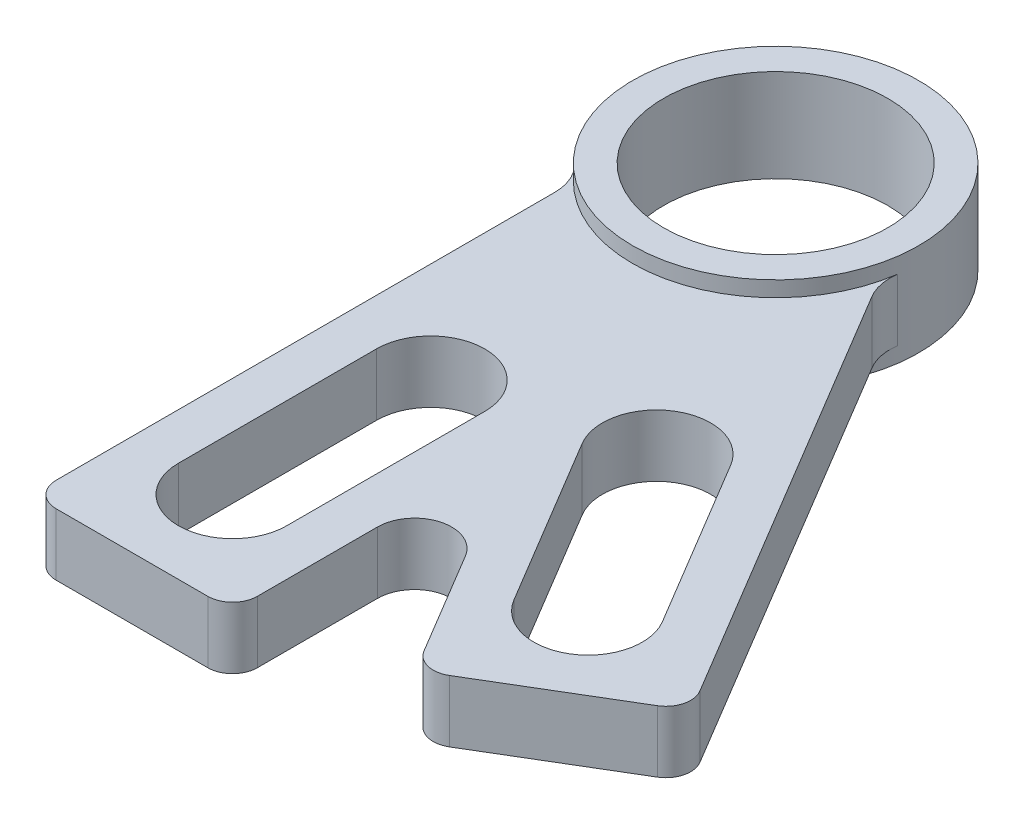
ISO-10303-21;
HEADER;
FILE_DESCRIPTION(('STEP AP214'),'2;1');
FILE_NAME('part.step','',(''),(''),'','','');
FILE_SCHEMA(('AUTOMOTIVE_DESIGN { 1 0 10303 214 1 1 1 1 }'));
ENDSEC;
DATA;
#1=APPLICATION_CONTEXT('core data for automotive mechanical design processes');
#2=APPLICATION_PROTOCOL_DEFINITION('international standard','automotive_design',2000,#1);
#3=PRODUCT_CONTEXT('',#1,'mechanical');
#4=PRODUCT('Part','Part','',(#3));
#5=PRODUCT_RELATED_PRODUCT_CATEGORY('part','',(#4));
#6=PRODUCT_DEFINITION_FORMATION('','',#4);
#7=PRODUCT_DEFINITION_CONTEXT('part definition',#1,'design');
#8=PRODUCT_DEFINITION('design','',#6,#7);
#9=PRODUCT_DEFINITION_SHAPE('','',#8);
#10=(LENGTH_UNIT() NAMED_UNIT(*) SI_UNIT(.MILLI.,.METRE.));
#11=(NAMED_UNIT(*) PLANE_ANGLE_UNIT() SI_UNIT($,.RADIAN.));
#12=(NAMED_UNIT(*) SI_UNIT($,.STERADIAN.) SOLID_ANGLE_UNIT());
#13=UNCERTAINTY_MEASURE_WITH_UNIT(LENGTH_MEASURE(1.E-05),#10,'distance_accuracy_value','');
#14=(GEOMETRIC_REPRESENTATION_CONTEXT(3) GLOBAL_UNCERTAINTY_ASSIGNED_CONTEXT((#13)) GLOBAL_UNIT_ASSIGNED_CONTEXT((#10,
#11,#12)) REPRESENTATION_CONTEXT('',''));
#15=CARTESIAN_POINT('',(0.,0.,0.));
#16=DIRECTION('',(0.,0.,1.));
#17=DIRECTION('',(1.,0.,0.));
#18=AXIS2_PLACEMENT_3D('',#15,#16,#17);
#19=CARTESIAN_POINT('',(0.,4.7625,0.));
#20=DIRECTION('',(0.,-1.,0.));
#21=DIRECTION('',(0.,0.,-1.));
#22=AXIS2_PLACEMENT_3D('',#19,#20,#21);
#23=CYLINDRICAL_SURFACE('',#22,11.5062);
#24=CARTESIAN_POINT('',(0.,4.7625,0.));
#25=DIRECTION('',(0.,1.,0.));
#26=DIRECTION('',(0.,0.,1.));
#27=AXIS2_PLACEMENT_3D('',#24,#25,#26);
#28=CIRCLE('',#27,11.5062);
#29=CARTESIAN_POINT('',(0.,4.7625,-11.5062));
#30=VERTEX_POINT('',#29);
#31=EDGE_CURVE('E300',#30,#30,#28,.T.);
#32=CARTESIAN_POINT('',(0.,-4.7625,0.));
#33=DIRECTION('',(0.,1.,0.));
#34=DIRECTION('',(0.,0.,1.));
#35=AXIS2_PLACEMENT_3D('',#32,#33,#34);
#36=CIRCLE('',#35,11.5062);
#37=CARTESIAN_POINT('',(0.,-4.7625,-11.5062));
#38=VERTEX_POINT('',#37);
#39=EDGE_CURVE('E295',#38,#38,#36,.T.);
#40=CARTESIAN_POINT('',(0.,4.7625,-11.5062));
#41=CARTESIAN_POINT('',(0.,4.66328125,-11.5062));
#42=CARTESIAN_POINT('',(0.,4.5640625,-11.5062));
#43=CARTESIAN_POINT('',(0.,4.365625,-11.5062));
#44=CARTESIAN_POINT('',(0.,4.26640625,-11.5062));
#45=CARTESIAN_POINT('',(0.,4.06796875,-11.5062));
#46=CARTESIAN_POINT('',(0.,3.96875,-11.5062));
#47=CARTESIAN_POINT('',(0.,3.7703125,-11.5062));
#48=CARTESIAN_POINT('',(0.,3.67109375,-11.5062));
#49=CARTESIAN_POINT('',(0.,3.47265625,-11.5062));
#50=CARTESIAN_POINT('',(0.,3.3734375,-11.5062));
#51=CARTESIAN_POINT('',(0.,3.175,-11.5062));
#52=CARTESIAN_POINT('',(0.,3.07578125,-11.5062));
#53=CARTESIAN_POINT('',(0.,2.87734375,-11.5062));
#54=CARTESIAN_POINT('',(0.,2.778125,-11.5062));
#55=CARTESIAN_POINT('',(0.,2.5796875,-11.5062));
#56=CARTESIAN_POINT('',(0.,2.48046875,-11.5062));
#57=CARTESIAN_POINT('',(0.,2.28203125,-11.5062));
#58=CARTESIAN_POINT('',(0.,2.1828125,-11.5062));
#59=CARTESIAN_POINT('',(0.,1.984375,-11.5062));
#60=CARTESIAN_POINT('',(0.,1.88515625,-11.5062));
#61=CARTESIAN_POINT('',(0.,1.68671875,-11.5062));
#62=CARTESIAN_POINT('',(0.,1.5875,-11.5062));
#63=CARTESIAN_POINT('',(0.,1.3890625,-11.5062));
#64=CARTESIAN_POINT('',(0.,1.28984375,-11.5062));
#65=CARTESIAN_POINT('',(0.,1.09140625,-11.5062));
#66=CARTESIAN_POINT('',(0.,0.992187499999999,-11.5062));
#67=CARTESIAN_POINT('',(0.,0.79375,-11.5062));
#68=CARTESIAN_POINT('',(0.,0.69453125,-11.5062));
#69=CARTESIAN_POINT('',(0.,0.49609375,-11.5062));
#70=CARTESIAN_POINT('',(0.,0.396875,-11.5062));
#71=CARTESIAN_POINT('',(0.,0.1984375,-11.5062));
#72=CARTESIAN_POINT('',(0.,0.0992187500000001,-11.5062));
#73=CARTESIAN_POINT('',(0.,-0.0992187500000001,-11.5062));
#74=CARTESIAN_POINT('',(0.,-0.1984375,-11.5062));
#75=CARTESIAN_POINT('',(0.,-0.396875,-11.5062));
#76=CARTESIAN_POINT('',(0.,-0.49609375,-11.5062));
#77=CARTESIAN_POINT('',(0.,-0.69453125,-11.5062));
#78=CARTESIAN_POINT('',(0.,-0.793750000000001,-11.5062));
#79=CARTESIAN_POINT('',(0.,-0.992187500000001,-11.5062));
#80=CARTESIAN_POINT('',(0.,-1.09140625,-11.5062));
#81=CARTESIAN_POINT('',(0.,-1.28984375,-11.5062));
#82=CARTESIAN_POINT('',(0.,-1.3890625,-11.5062));
#83=CARTESIAN_POINT('',(0.,-1.5875,-11.5062));
#84=CARTESIAN_POINT('',(0.,-1.68671875,-11.5062));
#85=CARTESIAN_POINT('',(0.,-1.88515625,-11.5062));
#86=CARTESIAN_POINT('',(0.,-1.984375,-11.5062));
#87=CARTESIAN_POINT('',(0.,-2.1828125,-11.5062));
#88=CARTESIAN_POINT('',(0.,-2.28203125,-11.5062));
#89=CARTESIAN_POINT('',(0.,-2.48046875,-11.5062));
#90=CARTESIAN_POINT('',(0.,-2.5796875,-11.5062));
#91=CARTESIAN_POINT('',(0.,-2.778125,-11.5062));
#92=CARTESIAN_POINT('',(0.,-2.87734375,-11.5062));
#93=CARTESIAN_POINT('',(0.,-3.07578125,-11.5062));
#94=CARTESIAN_POINT('',(0.,-3.175,-11.5062));
#95=CARTESIAN_POINT('',(0.,-3.3734375,-11.5062));
#96=CARTESIAN_POINT('',(0.,-3.47265625,-11.5062));
#97=CARTESIAN_POINT('',(0.,-3.67109375,-11.5062));
#98=CARTESIAN_POINT('',(0.,-3.7703125,-11.5062));
#99=CARTESIAN_POINT('',(0.,-3.96875,-11.5062));
#100=CARTESIAN_POINT('',(0.,-4.06796875,-11.5062));
#101=CARTESIAN_POINT('',(0.,-4.26640625,-11.5062));
#102=CARTESIAN_POINT('',(0.,-4.365625,-11.5062));
#103=CARTESIAN_POINT('',(0.,-4.5640625,-11.5062));
#104=CARTESIAN_POINT('',(0.,-4.66328125,-11.5062));
#105=CARTESIAN_POINT('',(0.,-4.7625,-11.5062));
#106=B_SPLINE_CURVE_WITH_KNOTS('',3,(#40,#41,#42,#43,#44,#45,#46,#47,#48,#49,#50,#51,#52,#53,
#54,#55,#56,#57,#58,#59,#60,#61,#62,#63,#64,#65,#66,#67,#68,#69,#70,#71,#72,#73,#74,#75,#76,#77,
#78,#79,#80,#81,#82,#83,#84,#85,#86,#87,#88,#89,#90,#91,#92,#93,#94,#95,#96,#97,#98,#99,#100,
#101,#102,#103,#104,#105),.UNSPECIFIED.,.F.,.F.,(4,2,2,2,2,2,2,2,2,2,2,2,2,2,2,2,2,2,2,2,2,2,2,
2,2,2,2,2,2,2,2,2,4),(0.,0.29765625,0.5953125,0.892968750000001,1.190625,1.48828125,1.7859375,
2.08359375,2.38125,2.67890625,2.9765625,3.27421875,3.571875,3.86953125,4.1671875,4.46484375,
4.7625,5.06015625,5.3578125,5.65546875,5.953125,6.25078125,6.5484375,6.84609375,7.14375,
7.44140625,7.7390625,8.03671875,8.334375,8.63203125,8.9296875,9.22734375,9.525),.UNSPECIFIED.);
#107=EDGE_CURVE('BSEAM43',#30,#38,#106,.T.);
#108=ORIENTED_EDGE('',*,*,#31,.T.);
#109=ORIENTED_EDGE('',*,*,#39,.F.);
#110=ORIENTED_EDGE('',*,*,#107,.T.);
#111=ORIENTED_EDGE('',*,*,#107,.F.);
#112=EDGE_LOOP('',(#108,#110,#109,#111));
#113=FACE_BOUND('',#112,.T.);
#114=ADVANCED_FACE('F43',(#113),#23,.F.);
#115=CARTESIAN_POINT('',(0.,4.7625,0.));
#116=DIRECTION('',(0.,-1.,0.));
#117=DIRECTION('',(0.,0.,-1.));
#118=AXIS2_PLACEMENT_3D('',#115,#116,#117);
#119=CYLINDRICAL_SURFACE('',#118,14.6812);
#120=DIRECTION('',(0.,-1.,0.));
#121=VECTOR('',#120,1.);
#122=CARTESIAN_POINT('',(14.5403853423193,4.7625,2.0285037680185));
#123=LINE('',#122,#121);
#124=CARTESIAN_POINT('',(14.5403853423193,3.175,2.0285037680185));
#125=VERTEX_POINT('',#124);
#126=CARTESIAN_POINT('',(14.5403853423193,-3.175,2.0285037680185));
#127=VERTEX_POINT('',#126);
#128=EDGE_CURVE('E314',#125,#127,#123,.T.);
#129=ORIENTED_EDGE('',*,*,#128,.T.);
#130=CARTESIAN_POINT('',(0.,-3.175,0.));
#131=DIRECTION('',(0.,1.,0.));
#132=DIRECTION('',(0.,0.,1.));
#133=AXIS2_PLACEMENT_3D('',#130,#131,#132);
#134=CIRCLE('',#133,14.6812);
#135=CARTESIAN_POINT('',(-11.4402024421594,-3.175,9.20105437014751));
#136=VERTEX_POINT('',#135);
#137=EDGE_CURVE('E273',#136,#127,#134,.T.);
#138=ORIENTED_EDGE('',*,*,#137,.F.);
#139=DIRECTION('',(0.,-1.,0.));
#140=VECTOR('',#139,1.);
#141=CARTESIAN_POINT('',(-11.4402024421594,4.7625,9.20105437014751));
#142=LINE('',#141,#140);
#143=CARTESIAN_POINT('',(-11.4402024421594,3.175,9.20105437014751));
#144=VERTEX_POINT('',#143);
#145=EDGE_CURVE('E307',#136,#144,#142,.F.);
#146=ORIENTED_EDGE('',*,*,#145,.T.);
#147=CARTESIAN_POINT('',(0.,3.175,0.));
#148=DIRECTION('',(0.,1.,0.));
#149=DIRECTION('',(0.,0.,1.));
#150=AXIS2_PLACEMENT_3D('',#147,#148,#149);
#151=CIRCLE('',#150,14.6812);
#152=EDGE_CURVE('E234',#144,#125,#151,.T.);
#153=ORIENTED_EDGE('',*,*,#152,.T.);
#154=EDGE_LOOP('',(#129,#138,#146,#153));
#155=FACE_BOUND('',#154,.T.);
#156=CARTESIAN_POINT('',(0.,4.7625,0.));
#157=DIRECTION('',(0.,1.,0.));
#158=DIRECTION('',(0.,0.,1.));
#159=AXIS2_PLACEMENT_3D('',#156,#157,#158);
#160=CIRCLE('',#159,14.6812);
#161=CARTESIAN_POINT('',(0.,4.7625,14.6812));
#162=VERTEX_POINT('',#161);
#163=EDGE_CURVE('E303',#162,#162,#160,.T.);
#164=ORIENTED_EDGE('',*,*,#163,.F.);
#165=EDGE_LOOP('',(#164));
#166=FACE_BOUND('',#165,.T.);
#167=CARTESIAN_POINT('',(0.,-4.7625,0.));
#168=DIRECTION('',(0.,1.,0.));
#169=DIRECTION('',(0.,0.,1.));
#170=AXIS2_PLACEMENT_3D('',#167,#168,#169);
#171=CIRCLE('',#170,14.6812);
#172=CARTESIAN_POINT('',(0.,-4.7625,14.6812));
#173=VERTEX_POINT('',#172);
#174=EDGE_CURVE('E304',#173,#173,#171,.T.);
#175=ORIENTED_EDGE('',*,*,#174,.T.);
#176=EDGE_LOOP('',(#175));
#177=FACE_BOUND('',#176,.T.);
#178=ADVANCED_FACE('F412',(#155,#166,#177),#119,.T.);
#179=CARTESIAN_POINT('',(0.,4.7625,0.));
#180=DIRECTION('',(0.,1.,0.));
#181=DIRECTION('',(0.,0.,1.));
#182=AXIS2_PLACEMENT_3D('',#179,#180,#181);
#183=PLANE('',#182);
#184=ORIENTED_EDGE('',*,*,#31,.F.);
#185=EDGE_LOOP('',(#184));
#186=FACE_BOUND('',#185,.T.);
#187=ORIENTED_EDGE('',*,*,#163,.T.);
#188=EDGE_LOOP('',(#187));
#189=FACE_BOUND('',#188,.T.);
#190=ADVANCED_FACE('F447',(#186,#189),#183,.T.);
#191=CARTESIAN_POINT('',(0.,-4.7625,0.));
#192=DIRECTION('',(0.,1.,0.));
#193=DIRECTION('',(0.,0.,1.));
#194=AXIS2_PLACEMENT_3D('',#191,#192,#193);
#195=PLANE('',#194);
#196=ORIENTED_EDGE('',*,*,#39,.T.);
#197=EDGE_LOOP('',(#196));
#198=FACE_BOUND('',#197,.T.);
#199=ORIENTED_EDGE('',*,*,#174,.F.);
#200=EDGE_LOOP('',(#199));
#201=FACE_BOUND('',#200,.T.);
#202=ADVANCED_FACE('F558',(#198,#201),#195,.F.);
#203=CARTESIAN_POINT('',(-10.31875,3.175,0.));
#204=DIRECTION('',(-1.,0.,0.));
#205=DIRECTION('',(0.,0.,1.));
#206=AXIS2_PLACEMENT_3D('',#203,#204,#205);
#207=PLANE('',#206);
#208=DIRECTION('',(0.,0.,-1.));
#209=VECTOR('',#208,1.);
#210=CARTESIAN_POINT('',(-10.31875,-3.175,0.));
#211=LINE('',#210,#209);
#212=CARTESIAN_POINT('',(-10.31875,-3.175,63.5));
#213=VERTEX_POINT('',#212);
#214=CARTESIAN_POINT('',(-10.31875,-3.175,12.3848102075688));
#215=VERTEX_POINT('',#214);
#216=EDGE_CURVE('E275',#213,#215,#211,.T.);
#217=ORIENTED_EDGE('',*,*,#216,.F.);
#218=DIRECTION('',(0.,-1.,0.));
#219=VECTOR('',#218,1.);
#220=CARTESIAN_POINT('',(-10.31875,3.175,63.5));
#221=LINE('',#220,#219);
#222=CARTESIAN_POINT('',(-10.31875,3.175,63.5));
#223=VERTEX_POINT('',#222);
#224=EDGE_CURVE('E366',#213,#223,#221,.F.);
#225=ORIENTED_EDGE('',*,*,#224,.T.);
#226=DIRECTION('',(0.,0.,-1.));
#227=VECTOR('',#226,1.);
#228=CARTESIAN_POINT('',(-10.31875,3.175,0.));
#229=LINE('',#228,#227);
#230=CARTESIAN_POINT('',(-10.31875,3.175,12.3848102075688));
#231=VERTEX_POINT('',#230);
#232=EDGE_CURVE('E236',#223,#231,#229,.T.);
#233=ORIENTED_EDGE('',*,*,#232,.T.);
#234=DIRECTION('',(0.,-1.,0.));
#235=VECTOR('',#234,1.);
#236=CARTESIAN_POINT('',(-10.31875,3.175,12.3848102075688));
#237=LINE('',#236,#235);
#238=EDGE_CURVE('E320',#231,#215,#237,.T.);
#239=ORIENTED_EDGE('',*,*,#238,.T.);
#240=EDGE_LOOP('',(#217,#225,#233,#239));
#241=FACE_BOUND('',#240,.T.);
#242=ADVANCED_FACE('F419',(#241),#207,.T.);
#243=CARTESIAN_POINT('',(0.,3.175,66.04));
#244=DIRECTION('',(0.,0.,-1.));
#245=DIRECTION('',(-1.,0.,0.));
#246=AXIS2_PLACEMENT_3D('',#243,#244,#245);
#247=PLANE('',#246);
#248=DIRECTION('',(1.,0.,0.));
#249=VECTOR('',#248,1.);
#250=CARTESIAN_POINT('',(0.,-3.175,66.04));
#251=LINE('',#250,#249);
#252=CARTESIAN_POINT('',(-7.77874999999999,-3.175,66.04));
#253=VERTEX_POINT('',#252);
#254=CARTESIAN_POINT('',(7.77875000000001,-3.175,66.04));
#255=VERTEX_POINT('',#254);
#256=EDGE_CURVE('E277',#253,#255,#251,.T.);
#257=ORIENTED_EDGE('',*,*,#256,.T.);
#258=DIRECTION('',(0.,-1.,0.));
#259=VECTOR('',#258,1.);
#260=CARTESIAN_POINT('',(7.77875000000001,3.175,66.04));
#261=LINE('',#260,#259);
#262=CARTESIAN_POINT('',(7.77875000000001,3.175,66.04));
#263=VERTEX_POINT('',#262);
#264=EDGE_CURVE('E364',#255,#263,#261,.F.);
#265=ORIENTED_EDGE('',*,*,#264,.T.);
#266=DIRECTION('',(1.,0.,0.));
#267=VECTOR('',#266,1.);
#268=CARTESIAN_POINT('',(0.,3.175,66.04));
#269=LINE('',#268,#267);
#270=CARTESIAN_POINT('',(-7.77874999999999,3.175,66.04));
#271=VERTEX_POINT('',#270);
#272=EDGE_CURVE('E238',#271,#263,#269,.T.);
#273=ORIENTED_EDGE('',*,*,#272,.F.);
#274=DIRECTION('',(0.,-1.,0.));
#275=VECTOR('',#274,1.);
#276=CARTESIAN_POINT('',(-7.77874999999999,-3.175,66.04));
#277=LINE('',#276,#275);
#278=EDGE_CURVE('E361',#271,#253,#277,.T.);
#279=ORIENTED_EDGE('',*,*,#278,.T.);
#280=EDGE_LOOP('',(#257,#265,#273,#279));
#281=FACE_BOUND('',#280,.T.);
#282=ADVANCED_FACE('F428',(#281),#247,.F.);
#283=CARTESIAN_POINT('',(10.31875,3.175,0.));
#284=DIRECTION('',(-1.,0.,0.));
#285=DIRECTION('',(0.,0.,1.));
#286=AXIS2_PLACEMENT_3D('',#283,#284,#285);
#287=PLANE('',#286);
#288=DIRECTION('',(0.,0.,-1.));
#289=VECTOR('',#288,1.);
#290=CARTESIAN_POINT('',(10.31875,-3.175,0.));
#291=LINE('',#290,#289);
#292=CARTESIAN_POINT('',(10.31875,-3.175,63.5));
#293=VERTEX_POINT('',#292);
#294=CARTESIAN_POINT('',(10.31875,-3.175,51.17750295843));
#295=VERTEX_POINT('',#294);
#296=EDGE_CURVE('E280',#293,#295,#291,.T.);
#297=ORIENTED_EDGE('',*,*,#296,.T.);
#298=DIRECTION('',(0.,-1.,0.));
#299=VECTOR('',#298,1.);
#300=CARTESIAN_POINT('',(10.31875,3.175,51.17750295843));
#301=LINE('',#300,#299);
#302=CARTESIAN_POINT('',(10.31875,3.175,51.17750295843));
#303=VERTEX_POINT('',#302);
#304=EDGE_CURVE('E64',#295,#303,#301,.F.);
#305=ORIENTED_EDGE('',*,*,#304,.T.);
#306=DIRECTION('',(0.,0.,-1.));
#307=VECTOR('',#306,1.);
#308=CARTESIAN_POINT('',(10.31875,3.175,0.));
#309=LINE('',#308,#307);
#310=CARTESIAN_POINT('',(10.31875,3.175,63.5));
#311=VERTEX_POINT('',#310);
#312=EDGE_CURVE('E241',#311,#303,#309,.T.);
#313=ORIENTED_EDGE('',*,*,#312,.F.);
#314=DIRECTION('',(0.,-1.,0.));
#315=VECTOR('',#314,1.);
#316=CARTESIAN_POINT('',(10.31875,3.175,63.5));
#317=LINE('',#316,#315);
#318=EDGE_CURVE('E358',#311,#293,#317,.T.);
#319=ORIENTED_EDGE('',*,*,#318,.T.);
#320=EDGE_LOOP('',(#297,#305,#313,#319));
#321=FACE_BOUND('',#320,.T.);
#322=ADVANCED_FACE('F434',(#321),#287,.F.);
#323=CARTESIAN_POINT('',(-8.85722342598743,3.175,5.29397721421647));
#324=DIRECTION('',(-0.858362052185321,0.,0.513044430208734));
#325=DIRECTION('',(0.513044430208734,0.,0.858362052185321));
#326=AXIS2_PLACEMENT_3D('',#323,#324,#325);
#327=PLANE('',#326);
#328=DIRECTION('',(-0.513044430208734,0.,-0.858362052185321));
#329=VECTOR('',#328,1.);
#330=CARTESIAN_POINT('',(-8.85722342598743,3.175,5.29397721421647));
#331=LINE('',#330,#329);
#332=CARTESIAN_POINT('',(23.7210978922672,3.175,59.7999675279844));
#333=VERTEX_POINT('',#332);
#334=CARTESIAN_POINT('',(17.3991094188261,3.175,49.2228036793348));
#335=VERTEX_POINT('',#334);
#336=EDGE_CURVE('E243',#333,#335,#331,.T.);
#337=ORIENTED_EDGE('',*,*,#336,.T.);
#338=DIRECTION('',(0.,-1.,0.));
#339=VECTOR('',#338,1.);
#340=CARTESIAN_POINT('',(17.3991094188261,3.175,49.2228036793348));
#341=LINE('',#340,#339);
#342=CARTESIAN_POINT('',(17.3991094188261,-3.175,49.2228036793348));
#343=VERTEX_POINT('',#342);
#344=EDGE_CURVE('E371',#335,#343,#341,.T.);
#345=ORIENTED_EDGE('',*,*,#344,.T.);
#346=DIRECTION('',(-0.513044430208734,0.,-0.858362052185321));
#347=VECTOR('',#346,1.);
#348=CARTESIAN_POINT('',(-8.85722342598743,-3.175,5.29397721421647));
#349=LINE('',#348,#347);
#350=CARTESIAN_POINT('',(23.7210978922672,-3.175,59.7999675279844));
#351=VERTEX_POINT('',#350);
#352=EDGE_CURVE('E282',#351,#343,#349,.T.);
#353=ORIENTED_EDGE('',*,*,#352,.F.);
#354=DIRECTION('',(0.,-1.,0.));
#355=VECTOR('',#354,1.);
#356=CARTESIAN_POINT('',(23.7210978922672,3.175,59.7999675279843));
#357=LINE('',#356,#355);
#358=EDGE_CURVE('E348',#351,#333,#357,.F.);
#359=ORIENTED_EDGE('',*,*,#358,.T.);
#360=EDGE_LOOP('',(#337,#345,#353,#359));
#361=FACE_BOUND('',#360,.T.);
#362=ADVANCED_FACE('F377',(#361),#327,.T.);
#363=CARTESIAN_POINT('',(33.8814541709848,3.175,56.6862299263186));
#364=DIRECTION('',(-0.513044430208734,0.,-0.858362052185321));
#365=DIRECTION('',(-0.858362052185321,0.,0.513044430208734));
#366=AXIS2_PLACEMENT_3D('',#363,#364,#365);
#367=PLANE('',#366);
#368=DIRECTION('',(0.858362052185321,0.,-0.513044430208734));
#369=VECTOR('',#368,1.);
#370=CARTESIAN_POINT('',(33.8814541709848,3.175,56.6862299263186));
#371=LINE('',#370,#369);
#372=CARTESIAN_POINT('',(27.2044703575481,3.175,60.6770742878049));
#373=VERTEX_POINT('',#372);
#374=CARTESIAN_POINT('',(40.5584379844212,3.175,52.6953855648325));
#375=VERTEX_POINT('',#374);
#376=EDGE_CURVE('E246',#373,#375,#371,.T.);
#377=ORIENTED_EDGE('',*,*,#376,.F.);
#378=DIRECTION('',(0.,-1.,0.));
#379=VECTOR('',#378,1.);
#380=CARTESIAN_POINT('',(27.2044703575481,-3.175,60.6770742878049));
#381=LINE('',#380,#379);
#382=CARTESIAN_POINT('',(27.2044703575481,-3.175,60.6770742878049));
#383=VERTEX_POINT('',#382);
#384=EDGE_CURVE('E337',#373,#383,#381,.T.);
#385=ORIENTED_EDGE('',*,*,#384,.T.);
#386=DIRECTION('',(0.858362052185321,0.,-0.513044430208734));
#387=VECTOR('',#386,1.);
#388=CARTESIAN_POINT('',(33.8814541709848,-3.175,56.6862299263186));
#389=LINE('',#388,#387);
#390=CARTESIAN_POINT('',(40.5584379844212,-3.175,52.6953855648325));
#391=VERTEX_POINT('',#390);
#392=EDGE_CURVE('E284',#383,#391,#389,.T.);
#393=ORIENTED_EDGE('',*,*,#392,.T.);
#394=DIRECTION('',(0.,-1.,0.));
#395=VECTOR('',#394,1.);
#396=CARTESIAN_POINT('',(40.5584379844212,3.175,52.6953855648325));
#397=LINE('',#396,#395);
#398=EDGE_CURVE('E335',#391,#375,#397,.F.);
#399=ORIENTED_EDGE('',*,*,#398,.T.);
#400=EDGE_LOOP('',(#377,#385,#393,#399));
#401=FACE_BOUND('',#400,.T.);
#402=ADVANCED_FACE('F390',(#401),#367,.F.);
#403=CARTESIAN_POINT('',(0.,3.175,35.40125));
#404=DIRECTION('',(0.,-1.,0.));
#405=DIRECTION('',(0.,0.,-1.));
#406=AXIS2_PLACEMENT_3D('',#403,#404,#405);
#407=CYLINDRICAL_SURFACE('',#406,5.55625);
#408=CARTESIAN_POINT('',(0.,-3.175,35.40125));
#409=DIRECTION('',(0.,1.,0.));
#410=DIRECTION('',(0.,0.,1.));
#411=AXIS2_PLACEMENT_3D('',#408,#409,#410);
#412=CIRCLE('',#411,5.55625);
#413=CARTESIAN_POINT('',(5.55625,-3.175,35.40125));
#414=VERTEX_POINT('',#413);
#415=CARTESIAN_POINT('',(-5.55624999999999,-3.175,35.40125));
#416=VERTEX_POINT('',#415);
#417=EDGE_CURVE('E261',#414,#416,#412,.T.);
#418=ORIENTED_EDGE('',*,*,#417,.F.);
#419=DIRECTION('',(0.,-1.,0.));
#420=VECTOR('',#419,1.);
#421=CARTESIAN_POINT('',(5.55625,3.175,35.40125));
#422=LINE('',#421,#420);
#423=CARTESIAN_POINT('',(5.55625,3.175,35.40125));
#424=VERTEX_POINT('',#423);
#425=EDGE_CURVE('E293',#424,#414,#422,.T.);
#426=ORIENTED_EDGE('',*,*,#425,.F.);
#427=CARTESIAN_POINT('',(0.,3.175,35.40125));
#428=DIRECTION('',(0.,1.,0.));
#429=DIRECTION('',(0.,0.,1.));
#430=AXIS2_PLACEMENT_3D('',#427,#428,#429);
#431=CIRCLE('',#430,5.55625);
#432=CARTESIAN_POINT('',(-5.55624999999999,3.175,35.40125));
#433=VERTEX_POINT('',#432);
#434=EDGE_CURVE('E223',#424,#433,#431,.T.);
#435=ORIENTED_EDGE('',*,*,#434,.T.);
#436=DIRECTION('',(0.,-1.,0.));
#437=VECTOR('',#436,1.);
#438=CARTESIAN_POINT('',(-5.55624999999999,3.175,35.40125));
#439=LINE('',#438,#437);
#440=EDGE_CURVE('E202',#433,#416,#439,.T.);
#441=ORIENTED_EDGE('',*,*,#440,.T.);
#442=EDGE_LOOP('',(#418,#426,#435,#441));
#443=FACE_BOUND('',#442,.T.);
#444=ADVANCED_FACE('F545',(#443),#407,.F.);
#445=CARTESIAN_POINT('',(5.55625,3.175,0.));
#446=DIRECTION('',(-1.,0.,0.));
#447=DIRECTION('',(0.,0.,1.));
#448=AXIS2_PLACEMENT_3D('',#445,#446,#447);
#449=PLANE('',#448);
#450=DIRECTION('',(0.,0.,-1.));
#451=VECTOR('',#450,1.);
#452=CARTESIAN_POINT('',(5.55625,-3.175,0.));
#453=LINE('',#452,#451);
#454=CARTESIAN_POINT('',(5.55625000000001,-3.175,55.72125));
#455=VERTEX_POINT('',#454);
#456=EDGE_CURVE('E264',#455,#414,#453,.T.);
#457=ORIENTED_EDGE('',*,*,#456,.F.);
#458=DIRECTION('',(0.,-1.,0.));
#459=VECTOR('',#458,1.);
#460=CARTESIAN_POINT('',(5.55625000000001,3.175,55.72125));
#461=LINE('',#460,#459);
#462=CARTESIAN_POINT('',(5.55625000000001,3.175,55.72125));
#463=VERTEX_POINT('',#462);
#464=EDGE_CURVE('E291',#463,#455,#461,.T.);
#465=ORIENTED_EDGE('',*,*,#464,.F.);
#466=DIRECTION('',(0.,0.,-1.));
#467=VECTOR('',#466,1.);
#468=CARTESIAN_POINT('',(5.55625,3.175,0.));
#469=LINE('',#468,#467);
#470=EDGE_CURVE('E226',#463,#424,#469,.T.);
#471=ORIENTED_EDGE('',*,*,#470,.T.);
#472=ORIENTED_EDGE('',*,*,#425,.T.);
#473=EDGE_LOOP('',(#457,#465,#471,#472));
#474=FACE_BOUND('',#473,.T.);
#475=ADVANCED_FACE('F635',(#474),#449,.T.);
#476=CARTESIAN_POINT('',(0.,3.175,55.72125));
#477=DIRECTION('',(0.,-1.,0.));
#478=DIRECTION('',(0.,0.,-1.));
#479=AXIS2_PLACEMENT_3D('',#476,#477,#478);
#480=CYLINDRICAL_SURFACE('',#479,5.55625);
#481=CARTESIAN_POINT('',(0.,-3.175,55.72125));
#482=DIRECTION('',(0.,1.,0.));
#483=DIRECTION('',(0.,0.,1.));
#484=AXIS2_PLACEMENT_3D('',#481,#482,#483);
#485=CIRCLE('',#484,5.55625);
#486=CARTESIAN_POINT('',(-5.55624999999999,-3.175,55.72125));
#487=VERTEX_POINT('',#486);
#488=EDGE_CURVE('E267',#487,#455,#485,.T.);
#489=ORIENTED_EDGE('',*,*,#488,.F.);
#490=DIRECTION('',(0.,-1.,0.));
#491=VECTOR('',#490,1.);
#492=CARTESIAN_POINT('',(-5.55624999999999,3.175,55.72125));
#493=LINE('',#492,#491);
#494=CARTESIAN_POINT('',(-5.55624999999999,3.175,55.72125));
#495=VERTEX_POINT('',#494);
#496=EDGE_CURVE('E289',#495,#487,#493,.T.);
#497=ORIENTED_EDGE('',*,*,#496,.F.);
#498=CARTESIAN_POINT('',(0.,3.175,55.72125));
#499=DIRECTION('',(0.,1.,0.));
#500=DIRECTION('',(0.,0.,1.));
#501=AXIS2_PLACEMENT_3D('',#498,#499,#500);
#502=CIRCLE('',#501,5.55625);
#503=EDGE_CURVE('E229',#495,#463,#502,.T.);
#504=ORIENTED_EDGE('',*,*,#503,.T.);
#505=ORIENTED_EDGE('',*,*,#464,.T.);
#506=EDGE_LOOP('',(#489,#497,#504,#505));
#507=FACE_BOUND('',#506,.T.);
#508=ADVANCED_FACE('F627',(#507),#480,.F.);
#509=CARTESIAN_POINT('',(18.1624141349268,3.175,30.3870895999257));
#510=DIRECTION('',(0.,-1.,0.));
#511=DIRECTION('',(0.,0.,-1.));
#512=AXIS2_PLACEMENT_3D('',#509,#510,#511);
#513=CYLINDRICAL_SURFACE('',#512,5.55625);
#514=CARTESIAN_POINT('',(18.1624141349268,-3.175,30.3870895999257));
#515=DIRECTION('',(0.,1.,0.));
#516=DIRECTION('',(0.,0.,1.));
#517=AXIS2_PLACEMENT_3D('',#514,#515,#516);
#518=CIRCLE('',#517,5.55625);
#519=CARTESIAN_POINT('',(22.9316882873815,-3.175,27.5364864845784));
#520=VERTEX_POINT('',#519);
#521=CARTESIAN_POINT('',(13.3931399824721,-3.175,33.237692715273));
#522=VERTEX_POINT('',#521);
#523=EDGE_CURVE('E197',#520,#522,#518,.T.);
#524=ORIENTED_EDGE('',*,*,#523,.F.);
#525=DIRECTION('',(0.,-1.,0.));
#526=VECTOR('',#525,1.);
#527=CARTESIAN_POINT('',(22.9316882873815,3.175,27.5364864845784));
#528=LINE('',#527,#526);
#529=CARTESIAN_POINT('',(22.9316882873815,3.175,27.5364864845784));
#530=VERTEX_POINT('',#529);
#531=EDGE_CURVE('E192',#530,#520,#528,.T.);
#532=ORIENTED_EDGE('',*,*,#531,.F.);
#533=CARTESIAN_POINT('',(18.1624141349268,3.175,30.3870895999257));
#534=DIRECTION('',(0.,1.,0.));
#535=DIRECTION('',(0.,0.,1.));
#536=AXIS2_PLACEMENT_3D('',#533,#534,#535);
#537=CIRCLE('',#536,5.55625);
#538=CARTESIAN_POINT('',(13.3931399824721,3.175,33.237692715273));
#539=VERTEX_POINT('',#538);
#540=EDGE_CURVE('E195',#530,#539,#537,.T.);
#541=ORIENTED_EDGE('',*,*,#540,.T.);
#542=DIRECTION('',(0.,-1.,0.));
#543=VECTOR('',#542,1.);
#544=CARTESIAN_POINT('',(13.3931399824721,3.175,33.237692715273));
#545=LINE('',#544,#543);
#546=EDGE_CURVE('E251',#539,#522,#545,.T.);
#547=ORIENTED_EDGE('',*,*,#546,.T.);
#548=EDGE_LOOP('',(#524,#532,#541,#547));
#549=FACE_BOUND('',#548,.T.);
#550=ADVANCED_FACE('F194',(#549),#513,.F.);
#551=CARTESIAN_POINT('',(4.76927415245452,3.175,-2.85060311534718));
#552=DIRECTION('',(-0.85836205218532,0.,0.513044430208734));
#553=DIRECTION('',(0.513044430208734,0.,0.858362052185321));
#554=AXIS2_PLACEMENT_3D('',#551,#552,#553);
#555=PLANE('',#554);
#556=DIRECTION('',(-0.513044430208734,0.,-0.858362052185321));
#557=VECTOR('',#556,1.);
#558=CARTESIAN_POINT('',(4.76927415245452,-3.175,-2.85060311534718));
#559=LINE('',#558,#557);
#560=CARTESIAN_POINT('',(33.356751109223,-3.175,44.9784033849841));
#561=VERTEX_POINT('',#560);
#562=EDGE_CURVE('E253',#561,#520,#559,.T.);
#563=ORIENTED_EDGE('',*,*,#562,.F.);
#564=DIRECTION('',(0.,-1.,0.));
#565=VECTOR('',#564,1.);
#566=CARTESIAN_POINT('',(33.356751109223,3.175,44.9784033849841));
#567=LINE('',#566,#565);
#568=CARTESIAN_POINT('',(33.356751109223,3.175,44.9784033849841));
#569=VERTEX_POINT('',#568);
#570=EDGE_CURVE('E203',#569,#561,#567,.T.);
#571=ORIENTED_EDGE('',*,*,#570,.F.);
#572=DIRECTION('',(-0.513044430208734,0.,-0.858362052185321));
#573=VECTOR('',#572,1.);
#574=CARTESIAN_POINT('',(4.76927415245452,3.175,-2.85060311534718));
#575=LINE('',#574,#573);
#576=EDGE_CURVE('E210',#569,#530,#575,.T.);
#577=ORIENTED_EDGE('',*,*,#576,.T.);
#578=ORIENTED_EDGE('',*,*,#531,.T.);
#579=EDGE_LOOP('',(#563,#571,#577,#578));
#580=FACE_BOUND('',#579,.T.);
#581=ADVANCED_FACE('F217',(#580),#555,.T.);
#582=CARTESIAN_POINT('',(28.5874769567683,3.175,47.8290065003314));
#583=DIRECTION('',(0.,-1.,0.));
#584=DIRECTION('',(0.,0.,-1.));
#585=AXIS2_PLACEMENT_3D('',#582,#583,#584);
#586=CYLINDRICAL_SURFACE('',#585,5.55625);
#587=CARTESIAN_POINT('',(28.5874769567683,-3.175,47.8290065003314));
#588=DIRECTION('',(0.,1.,0.));
#589=DIRECTION('',(0.,0.,1.));
#590=AXIS2_PLACEMENT_3D('',#587,#588,#589);
#591=CIRCLE('',#590,5.55625);
#592=CARTESIAN_POINT('',(23.8182028043136,-3.175,50.6796096156787));
#593=VERTEX_POINT('',#592);
#594=EDGE_CURVE('E255',#593,#561,#591,.T.);
#595=ORIENTED_EDGE('',*,*,#594,.F.);
#596=DIRECTION('',(0.,-1.,0.));
#597=VECTOR('',#596,1.);
#598=CARTESIAN_POINT('',(23.8182028043136,3.175,50.6796096156787));
#599=LINE('',#598,#597);
#600=CARTESIAN_POINT('',(23.8182028043136,3.175,50.6796096156787));
#601=VERTEX_POINT('',#600);
#602=EDGE_CURVE('E297',#601,#593,#599,.T.);
#603=ORIENTED_EDGE('',*,*,#602,.F.);
#604=CARTESIAN_POINT('',(28.5874769567683,3.175,47.8290065003314));
#605=DIRECTION('',(0.,1.,0.));
#606=DIRECTION('',(0.,0.,1.));
#607=AXIS2_PLACEMENT_3D('',#604,#605,#606);
#608=CIRCLE('',#607,5.55625);
#609=EDGE_CURVE('E218',#601,#569,#608,.T.);
#610=ORIENTED_EDGE('',*,*,#609,.T.);
#611=ORIENTED_EDGE('',*,*,#570,.T.);
#612=EDGE_LOOP('',(#595,#603,#610,#611));
#613=FACE_BOUND('',#612,.T.);
#614=ADVANCED_FACE('F603',(#613),#586,.F.);
#615=CARTESIAN_POINT('',(-5.55624999999999,3.175,0.));
#616=DIRECTION('',(-1.,0.,0.));
#617=DIRECTION('',(0.,0.,1.));
#618=AXIS2_PLACEMENT_3D('',#615,#616,#617);
#619=PLANE('',#618);
#620=DIRECTION('',(0.,0.,-1.));
#621=VECTOR('',#620,1.);
#622=CARTESIAN_POINT('',(-5.55624999999999,-3.175,0.));
#623=LINE('',#622,#621);
#624=EDGE_CURVE('E270',#487,#416,#623,.T.);
#625=ORIENTED_EDGE('',*,*,#624,.T.);
#626=ORIENTED_EDGE('',*,*,#440,.F.);
#627=DIRECTION('',(0.,0.,-1.));
#628=VECTOR('',#627,1.);
#629=CARTESIAN_POINT('',(-5.55624999999999,3.175,0.));
#630=LINE('',#629,#628);
#631=EDGE_CURVE('E232',#495,#433,#630,.T.);
#632=ORIENTED_EDGE('',*,*,#631,.F.);
#633=ORIENTED_EDGE('',*,*,#496,.T.);
#634=EDGE_LOOP('',(#625,#626,#632,#633));
#635=FACE_BOUND('',#634,.T.);
#636=ADVANCED_FACE('F594',(#635),#619,.F.);
#637=CARTESIAN_POINT('',(-4.76927415245485,3.175,2.85060311534737));
#638=DIRECTION('',(-0.858362052185321,0.,0.513044430208734));
#639=DIRECTION('',(0.513044430208734,0.,0.858362052185321));
#640=AXIS2_PLACEMENT_3D('',#637,#638,#639);
#641=PLANE('',#640);
#642=DIRECTION('',(-0.513044430208734,0.,-0.858362052185321));
#643=VECTOR('',#642,1.);
#644=CARTESIAN_POINT('',(-4.76927415245485,-3.175,2.85060311534737));
#645=LINE('',#644,#643);
#646=EDGE_CURVE('E258',#593,#522,#645,.T.);
#647=ORIENTED_EDGE('',*,*,#646,.T.);
#648=ORIENTED_EDGE('',*,*,#546,.F.);
#649=DIRECTION('',(-0.513044430208734,0.,-0.858362052185321));
#650=VECTOR('',#649,1.);
#651=CARTESIAN_POINT('',(-4.76927415245485,3.175,2.85060311534737));
#652=LINE('',#651,#650);
#653=EDGE_CURVE('E213',#601,#539,#652,.T.);
#654=ORIENTED_EDGE('',*,*,#653,.F.);
#655=ORIENTED_EDGE('',*,*,#602,.T.);
#656=EDGE_LOOP('',(#647,#648,#654,#655));
#657=FACE_BOUND('',#656,.T.);
#658=ADVANCED_FACE('F537',(#657),#641,.F.);
#659=CARTESIAN_POINT('',(8.85722342598713,3.175,-5.29397721421628));
#660=DIRECTION('',(-0.858362052185321,0.,0.513044430208734));
#661=DIRECTION('',(0.513044430208734,0.,0.858362052185321));
#662=AXIS2_PLACEMENT_3D('',#659,#660,#661);
#663=PLANE('',#662);
#664=DIRECTION('',(-0.513044430208734,0.,-0.858362052185321));
#665=VECTOR('',#664,1.);
#666=CARTESIAN_POINT('',(8.85722342598713,3.175,-5.29397721421628));
#667=LINE('',#666,#665);
#668=CARTESIAN_POINT('',(41.4355447442417,3.175,49.2120130995516));
#669=VERTEX_POINT('',#668);
#670=CARTESIAN_POINT('',(15.2111813221727,3.175,5.33667389147836));
#671=VERTEX_POINT('',#670);
#672=EDGE_CURVE('E249',#669,#671,#667,.T.);
#673=ORIENTED_EDGE('',*,*,#672,.F.);
#674=DIRECTION('',(0.,-1.,0.));
#675=VECTOR('',#674,1.);
#676=CARTESIAN_POINT('',(41.4355447442417,3.175,49.2120130995516));
#677=LINE('',#676,#675);
#678=CARTESIAN_POINT('',(41.4355447442417,-3.175,49.2120130995516));
#679=VERTEX_POINT('',#678);
#680=EDGE_CURVE('E368',#669,#679,#677,.T.);
#681=ORIENTED_EDGE('',*,*,#680,.T.);
#682=DIRECTION('',(-0.513044430208734,0.,-0.858362052185321));
#683=VECTOR('',#682,1.);
#684=CARTESIAN_POINT('',(8.85722342598713,-3.175,-5.29397721421628));
#685=LINE('',#684,#683);
#686=CARTESIAN_POINT('',(15.2111813221727,-3.175,5.33667389147836));
#687=VERTEX_POINT('',#686);
#688=EDGE_CURVE('E215',#679,#687,#685,.T.);
#689=ORIENTED_EDGE('',*,*,#688,.T.);
#690=DIRECTION('',(0.,1.,0.));
#691=VECTOR('',#690,1.);
#692=CARTESIAN_POINT('',(15.2111813221727,3.175,5.33667389147835));
#693=LINE('',#692,#691);
#694=EDGE_CURVE('E317',#687,#671,#693,.T.);
#695=ORIENTED_EDGE('',*,*,#694,.T.);
#696=EDGE_LOOP('',(#673,#681,#689,#695));
#697=FACE_BOUND('',#696,.T.);
#698=ADVANCED_FACE('F400',(#697),#663,.F.);
#699=CARTESIAN_POINT('',(0.,3.175,0.));
#700=DIRECTION('',(0.,1.,0.));
#701=DIRECTION('',(0.,0.,1.));
#702=AXIS2_PLACEMENT_3D('',#699,#700,#701);
#703=PLANE('',#702);
#704=ORIENTED_EDGE('',*,*,#540,.F.);
#705=ORIENTED_EDGE('',*,*,#576,.F.);
#706=ORIENTED_EDGE('',*,*,#609,.F.);
#707=ORIENTED_EDGE('',*,*,#653,.T.);
#708=EDGE_LOOP('',(#704,#705,#706,#707));
#709=FACE_BOUND('',#708,.T.);
#710=ORIENTED_EDGE('',*,*,#434,.F.);
#711=ORIENTED_EDGE('',*,*,#470,.F.);
#712=ORIENTED_EDGE('',*,*,#503,.F.);
#713=ORIENTED_EDGE('',*,*,#631,.T.);
#714=EDGE_LOOP('',(#710,#711,#712,#713));
#715=FACE_BOUND('',#714,.T.);
#716=ORIENTED_EDGE('',*,*,#336,.F.);
#717=CARTESIAN_POINT('',(25.9013375048179,3.175,58.4968346752542));
#718=DIRECTION('',(0.,1.,0.));
#719=DIRECTION('',(0.,0.,1.));
#720=AXIS2_PLACEMENT_3D('',#717,#718,#719);
#721=CIRCLE('',#720,2.54);
#722=EDGE_CURVE('E356',#333,#373,#721,.T.);
#723=ORIENTED_EDGE('',*,*,#722,.T.);
#724=ORIENTED_EDGE('',*,*,#376,.T.);
#725=CARTESIAN_POINT('',(39.255305131691,3.175,50.5151459522818));
#726=DIRECTION('',(0.,1.,0.));
#727=DIRECTION('',(0.,0.,1.));
#728=AXIS2_PLACEMENT_3D('',#725,#726,#727);
#729=CIRCLE('',#728,2.54);
#730=EDGE_CURVE('E350',#375,#669,#729,.T.);
#731=ORIENTED_EDGE('',*,*,#730,.T.);
#732=ORIENTED_EDGE('',*,*,#672,.T.);
#733=CARTESIAN_POINT('',(19.5716605472741,3.175,2.73040818601798));
#734=DIRECTION('',(0.,1.,0.));
#735=DIRECTION('',(0.,0.,1.));
#736=AXIS2_PLACEMENT_3D('',#733,#734,#735);
#737=CIRCLE('',#736,5.08);
#738=EDGE_CURVE('E326',#671,#125,#737,.F.);
#739=ORIENTED_EDGE('',*,*,#738,.T.);
#740=ORIENTED_EDGE('',*,*,#152,.F.);
#741=CARTESIAN_POINT('',(-15.39875,3.175,12.3848102075688));
#742=DIRECTION('',(0.,1.,0.));
#743=DIRECTION('',(0.,0.,1.));
#744=AXIS2_PLACEMENT_3D('',#741,#742,#743);
#745=CIRCLE('',#744,5.08);
#746=EDGE_CURVE('E332',#144,#231,#745,.F.);
#747=ORIENTED_EDGE('',*,*,#746,.T.);
#748=ORIENTED_EDGE('',*,*,#232,.F.);
#749=CARTESIAN_POINT('',(-7.77874999999999,3.175,63.5));
#750=DIRECTION('',(0.,1.,0.));
#751=DIRECTION('',(0.,0.,1.));
#752=AXIS2_PLACEMENT_3D('',#749,#750,#751);
#753=CIRCLE('',#752,2.54);
#754=EDGE_CURVE('E352',#223,#271,#753,.T.);
#755=ORIENTED_EDGE('',*,*,#754,.T.);
#756=ORIENTED_EDGE('',*,*,#272,.T.);
#757=CARTESIAN_POINT('',(7.77875000000001,3.175,63.5));
#758=DIRECTION('',(0.,1.,0.));
#759=DIRECTION('',(0.,0.,1.));
#760=AXIS2_PLACEMENT_3D('',#757,#758,#759);
#761=CIRCLE('',#760,2.54);
#762=EDGE_CURVE('E354',#263,#311,#761,.T.);
#763=ORIENTED_EDGE('',*,*,#762,.T.);
#764=ORIENTED_EDGE('',*,*,#312,.T.);
#765=CARTESIAN_POINT('',(14.12875,3.175,51.17750295843));
#766=DIRECTION('',(0.,1.,0.));
#767=DIRECTION('',(0.,0.,1.));
#768=AXIS2_PLACEMENT_3D('',#765,#766,#767);
#769=CIRCLE('',#768,3.81);
#770=EDGE_CURVE('E11',#303,#335,#769,.F.);
#771=ORIENTED_EDGE('',*,*,#770,.T.);
#772=EDGE_LOOP('',(#716,#723,#724,#731,#732,#739,#740,#747,#748,#755,#756,#763,#764,#771));
#773=FACE_BOUND('',#772,.T.);
#774=ADVANCED_FACE('F207',(#709,#715,#773),#703,.T.);
#775=CARTESIAN_POINT('',(0.,-3.175,0.));
#776=DIRECTION('',(0.,1.,0.));
#777=DIRECTION('',(0.,0.,1.));
#778=AXIS2_PLACEMENT_3D('',#775,#776,#777);
#779=PLANE('',#778);
#780=ORIENTED_EDGE('',*,*,#523,.T.);
#781=ORIENTED_EDGE('',*,*,#646,.F.);
#782=ORIENTED_EDGE('',*,*,#594,.T.);
#783=ORIENTED_EDGE('',*,*,#562,.T.);
#784=EDGE_LOOP('',(#780,#781,#782,#783));
#785=FACE_BOUND('',#784,.T.);
#786=ORIENTED_EDGE('',*,*,#417,.T.);
#787=ORIENTED_EDGE('',*,*,#624,.F.);
#788=ORIENTED_EDGE('',*,*,#488,.T.);
#789=ORIENTED_EDGE('',*,*,#456,.T.);
#790=EDGE_LOOP('',(#786,#787,#788,#789));
#791=FACE_BOUND('',#790,.T.);
#792=ORIENTED_EDGE('',*,*,#392,.F.);
#793=CARTESIAN_POINT('',(25.9013375048179,-3.175,58.4968346752542));
#794=DIRECTION('',(0.,1.,0.));
#795=DIRECTION('',(0.,0.,1.));
#796=AXIS2_PLACEMENT_3D('',#793,#794,#795);
#797=CIRCLE('',#796,2.54);
#798=EDGE_CURVE('E346',#383,#351,#797,.F.);
#799=ORIENTED_EDGE('',*,*,#798,.T.);
#800=ORIENTED_EDGE('',*,*,#352,.T.);
#801=CARTESIAN_POINT('',(14.12875,-3.175,51.17750295843));
#802=DIRECTION('',(0.,1.,0.));
#803=DIRECTION('',(0.,0.,1.));
#804=AXIS2_PLACEMENT_3D('',#801,#802,#803);
#805=CIRCLE('',#804,3.81);
#806=EDGE_CURVE('E51',#343,#295,#805,.T.);
#807=ORIENTED_EDGE('',*,*,#806,.T.);
#808=ORIENTED_EDGE('',*,*,#296,.F.);
#809=CARTESIAN_POINT('',(7.77875000000001,-3.175,63.5));
#810=DIRECTION('',(0.,1.,0.));
#811=DIRECTION('',(0.,0.,1.));
#812=AXIS2_PLACEMENT_3D('',#809,#810,#811);
#813=CIRCLE('',#812,2.54);
#814=EDGE_CURVE('E344',#293,#255,#813,.F.);
#815=ORIENTED_EDGE('',*,*,#814,.T.);
#816=ORIENTED_EDGE('',*,*,#256,.F.);
#817=CARTESIAN_POINT('',(-7.77874999999999,-3.175,63.5));
#818=DIRECTION('',(0.,1.,0.));
#819=DIRECTION('',(0.,0.,1.));
#820=AXIS2_PLACEMENT_3D('',#817,#818,#819);
#821=CIRCLE('',#820,2.54);
#822=EDGE_CURVE('E342',#253,#213,#821,.F.);
#823=ORIENTED_EDGE('',*,*,#822,.T.);
#824=ORIENTED_EDGE('',*,*,#216,.T.);
#825=CARTESIAN_POINT('',(-15.39875,-3.175,12.3848102075688));
#826=DIRECTION('',(0.,1.,0.));
#827=DIRECTION('',(0.,0.,1.));
#828=AXIS2_PLACEMENT_3D('',#825,#826,#827);
#829=CIRCLE('',#828,5.08);
#830=EDGE_CURVE('E329',#215,#136,#829,.T.);
#831=ORIENTED_EDGE('',*,*,#830,.T.);
#832=ORIENTED_EDGE('',*,*,#137,.T.);
#833=CARTESIAN_POINT('',(19.5716605472741,-3.175,2.73040818601798));
#834=DIRECTION('',(0.,1.,0.));
#835=DIRECTION('',(0.,0.,1.));
#836=AXIS2_PLACEMENT_3D('',#833,#834,#835);
#837=CIRCLE('',#836,5.08);
#838=EDGE_CURVE('E323',#127,#687,#837,.T.);
#839=ORIENTED_EDGE('',*,*,#838,.T.);
#840=ORIENTED_EDGE('',*,*,#688,.F.);
#841=CARTESIAN_POINT('',(39.255305131691,-3.175,50.5151459522818));
#842=DIRECTION('',(0.,1.,0.));
#843=DIRECTION('',(0.,0.,1.));
#844=AXIS2_PLACEMENT_3D('',#841,#842,#843);
#845=CIRCLE('',#844,2.54);
#846=EDGE_CURVE('E340',#679,#391,#845,.F.);
#847=ORIENTED_EDGE('',*,*,#846,.T.);
#848=EDGE_LOOP('',(#792,#799,#800,#807,#808,#815,#816,#823,#824,#831,#832,#839,#840,#847));
#849=FACE_BOUND('',#848,.T.);
#850=ADVANCED_FACE('F383',(#785,#791,#849),#779,.F.);
#851=CARTESIAN_POINT('',(19.5716605472741,4.7625,2.73040818601798));
#852=DIRECTION('',(0.,-1.,0.));
#853=DIRECTION('',(0.,0.,-1.));
#854=AXIS2_PLACEMENT_3D('',#851,#852,#853);
#855=CYLINDRICAL_SURFACE('',#854,5.08);
#856=ORIENTED_EDGE('',*,*,#738,.F.);
#857=ORIENTED_EDGE('',*,*,#694,.F.);
#858=ORIENTED_EDGE('',*,*,#838,.F.);
#859=ORIENTED_EDGE('',*,*,#128,.F.);
#860=EDGE_LOOP('',(#856,#857,#858,#859));
#861=FACE_BOUND('',#860,.T.);
#862=ADVANCED_FACE('F406',(#861),#855,.F.);
#863=CARTESIAN_POINT('',(-15.39875,4.7625,12.3848102075688));
#864=DIRECTION('',(0.,-1.,0.));
#865=DIRECTION('',(0.,0.,-1.));
#866=AXIS2_PLACEMENT_3D('',#863,#864,#865);
#867=CYLINDRICAL_SURFACE('',#866,5.08);
#868=ORIENTED_EDGE('',*,*,#746,.F.);
#869=ORIENTED_EDGE('',*,*,#145,.F.);
#870=ORIENTED_EDGE('',*,*,#830,.F.);
#871=ORIENTED_EDGE('',*,*,#238,.F.);
#872=EDGE_LOOP('',(#868,#869,#870,#871));
#873=FACE_BOUND('',#872,.T.);
#874=ADVANCED_FACE('F416',(#873),#867,.F.);
#875=CARTESIAN_POINT('',(25.9013375048179,3.175,58.4968346752542));
#876=DIRECTION('',(0.,1.,0.));
#877=DIRECTION('',(0.,0.,1.));
#878=AXIS2_PLACEMENT_3D('',#875,#876,#877);
#879=CYLINDRICAL_SURFACE('',#878,2.54);
#880=ORIENTED_EDGE('',*,*,#722,.F.);
#881=ORIENTED_EDGE('',*,*,#358,.F.);
#882=ORIENTED_EDGE('',*,*,#798,.F.);
#883=ORIENTED_EDGE('',*,*,#384,.F.);
#884=EDGE_LOOP('',(#880,#881,#882,#883));
#885=FACE_BOUND('',#884,.T.);
#886=ADVANCED_FACE('F387',(#885),#879,.T.);
#887=CARTESIAN_POINT('',(7.77875000000001,3.175,63.5));
#888=DIRECTION('',(0.,-1.,0.));
#889=DIRECTION('',(0.,0.,-1.));
#890=AXIS2_PLACEMENT_3D('',#887,#888,#889);
#891=CYLINDRICAL_SURFACE('',#890,2.54);
#892=ORIENTED_EDGE('',*,*,#762,.F.);
#893=ORIENTED_EDGE('',*,*,#264,.F.);
#894=ORIENTED_EDGE('',*,*,#814,.F.);
#895=ORIENTED_EDGE('',*,*,#318,.F.);
#896=EDGE_LOOP('',(#892,#893,#894,#895));
#897=FACE_BOUND('',#896,.T.);
#898=ADVANCED_FACE('F433',(#897),#891,.T.);
#899=CARTESIAN_POINT('',(-7.77874999999999,3.175,63.5));
#900=DIRECTION('',(0.,1.,0.));
#901=DIRECTION('',(0.,0.,1.));
#902=AXIS2_PLACEMENT_3D('',#899,#900,#901);
#903=CYLINDRICAL_SURFACE('',#902,2.54);
#904=ORIENTED_EDGE('',*,*,#754,.F.);
#905=ORIENTED_EDGE('',*,*,#224,.F.);
#906=ORIENTED_EDGE('',*,*,#822,.F.);
#907=ORIENTED_EDGE('',*,*,#278,.F.);
#908=EDGE_LOOP('',(#904,#905,#906,#907));
#909=FACE_BOUND('',#908,.T.);
#910=ADVANCED_FACE('F425',(#909),#903,.T.);
#911=CARTESIAN_POINT('',(39.255305131691,3.175,50.5151459522818));
#912=DIRECTION('',(0.,-1.,0.));
#913=DIRECTION('',(0.,0.,-1.));
#914=AXIS2_PLACEMENT_3D('',#911,#912,#913);
#915=CYLINDRICAL_SURFACE('',#914,2.54);
#916=ORIENTED_EDGE('',*,*,#730,.F.);
#917=ORIENTED_EDGE('',*,*,#398,.F.);
#918=ORIENTED_EDGE('',*,*,#846,.F.);
#919=ORIENTED_EDGE('',*,*,#680,.F.);
#920=EDGE_LOOP('',(#916,#917,#918,#919));
#921=FACE_BOUND('',#920,.T.);
#922=ADVANCED_FACE('F397',(#921),#915,.T.);
#923=CARTESIAN_POINT('',(14.12875,3.175,51.17750295843));
#924=DIRECTION('',(0.,-1.,0.));
#925=DIRECTION('',(0.,0.,-1.));
#926=AXIS2_PLACEMENT_3D('',#923,#924,#925);
#927=CYLINDRICAL_SURFACE('',#926,3.81);
#928=ORIENTED_EDGE('',*,*,#770,.F.);
#929=ORIENTED_EDGE('',*,*,#304,.F.);
#930=ORIENTED_EDGE('',*,*,#806,.F.);
#931=ORIENTED_EDGE('',*,*,#344,.F.);
#932=EDGE_LOOP('',(#928,#929,#930,#931));
#933=FACE_BOUND('',#932,.T.);
#934=ADVANCED_FACE('F45',(#933),#927,.F.);
#935=CLOSED_SHELL('',(#114,#178,#190,#202,#242,#282,#322,#362,#402,#444,#475,#508,#550,#581,
#614,#636,#658,#698,#774,#850,#862,#874,#886,#898,#910,#922,#934));
#936=MANIFOLD_SOLID_BREP('B2',#935);
#937=ADVANCED_BREP_SHAPE_REPRESENTATION('',(#18,#936),#14);
#938=SHAPE_DEFINITION_REPRESENTATION(#9,#937);
ENDSEC;
END-ISO-10303-21;
